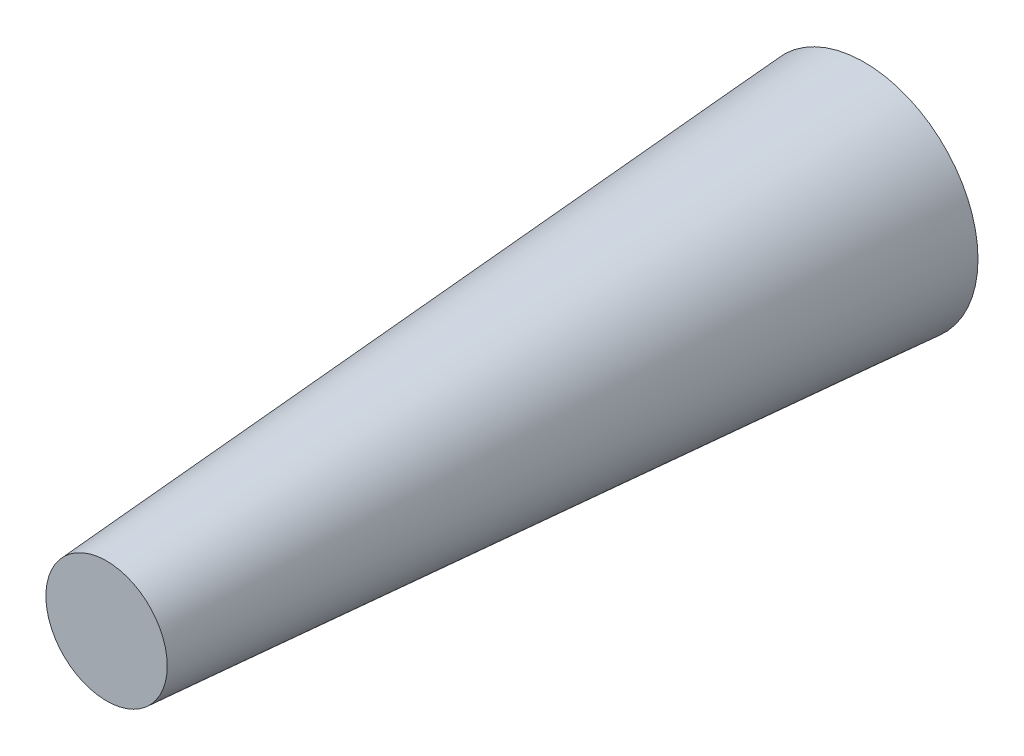
ISO-10303-21;
HEADER;
FILE_DESCRIPTION(('STEP AP214'),'2;1');
FILE_NAME('part.step','',(''),(''),'','','');
FILE_SCHEMA(('AUTOMOTIVE_DESIGN { 1 0 10303 214 1 1 1 1 }'));
ENDSEC;
DATA;
#1=APPLICATION_CONTEXT('core data for automotive mechanical design processes');
#2=APPLICATION_PROTOCOL_DEFINITION('international standard','automotive_design',2000,#1);
#3=PRODUCT_CONTEXT('',#1,'mechanical');
#4=PRODUCT('Part','Part','',(#3));
#5=PRODUCT_RELATED_PRODUCT_CATEGORY('part','',(#4));
#6=PRODUCT_DEFINITION_FORMATION('','',#4);
#7=PRODUCT_DEFINITION_CONTEXT('part definition',#1,'design');
#8=PRODUCT_DEFINITION('design','',#6,#7);
#9=PRODUCT_DEFINITION_SHAPE('','',#8);
#10=(LENGTH_UNIT() NAMED_UNIT(*) SI_UNIT(.MILLI.,.METRE.));
#11=(NAMED_UNIT(*) PLANE_ANGLE_UNIT() SI_UNIT($,.RADIAN.));
#12=(NAMED_UNIT(*) SI_UNIT($,.STERADIAN.) SOLID_ANGLE_UNIT());
#13=UNCERTAINTY_MEASURE_WITH_UNIT(LENGTH_MEASURE(1.E-05),#10,'distance_accuracy_value','');
#14=(GEOMETRIC_REPRESENTATION_CONTEXT(3) GLOBAL_UNCERTAINTY_ASSIGNED_CONTEXT((#13)) GLOBAL_UNIT_ASSIGNED_CONTEXT((#10,
#11,#12)) REPRESENTATION_CONTEXT('',''));
#15=CARTESIAN_POINT('',(0.,0.,0.));
#16=DIRECTION('',(0.,0.,1.));
#17=DIRECTION('',(1.,0.,0.));
#18=AXIS2_PLACEMENT_3D('',#15,#16,#17);
#19=CARTESIAN_POINT('',(0.,0.,0.));
#20=DIRECTION('',(0.,0.,-1.));
#21=DIRECTION('',(1.,0.,0.));
#22=AXIS2_PLACEMENT_3D('',#19,#20,#21);
#23=CONICAL_SURFACE('',#22,1.5,0.0698131700797732);
#24=CARTESIAN_POINT('',(0.,0.,10.));
#25=DIRECTION('',(0.,0.,1.));
#26=DIRECTION('',(1.,0.,0.));
#27=AXIS2_PLACEMENT_3D('',#24,#25,#26);
#28=CIRCLE('',#27,0.800731880564897);
#29=CARTESIAN_POINT('',(0.800731880564897,0.,10.));
#30=VERTEX_POINT('',#29);
#31=EDGE_CURVE('E10',#30,#30,#28,.T.);
#32=ORIENTED_EDGE('',*,*,#31,.F.);
#33=EDGE_LOOP('',(#32));
#34=FACE_BOUND('',#33,.T.);
#35=CARTESIAN_POINT('',(0.,0.,0.));
#36=DIRECTION('',(0.,0.,1.));
#37=DIRECTION('',(1.,0.,0.));
#38=AXIS2_PLACEMENT_3D('',#35,#36,#37);
#39=CIRCLE('',#38,1.5);
#40=CARTESIAN_POINT('',(1.5,0.,0.));
#41=VERTEX_POINT('',#40);
#42=EDGE_CURVE('E50',#41,#41,#39,.T.);
#43=ORIENTED_EDGE('',*,*,#42,.T.);
#44=EDGE_LOOP('',(#43));
#45=FACE_BOUND('',#44,.T.);
#46=ADVANCED_FACE('F43',(#34,#45),#23,.T.);
#47=CARTESIAN_POINT('',(0.,0.,10.));
#48=DIRECTION('',(0.,0.,1.));
#49=DIRECTION('',(1.,0.,0.));
#50=AXIS2_PLACEMENT_3D('',#47,#48,#49);
#51=PLANE('',#50);
#52=ORIENTED_EDGE('',*,*,#31,.T.);
#53=EDGE_LOOP('',(#52));
#54=FACE_BOUND('',#53,.T.);
#55=ADVANCED_FACE('F60',(#54),#51,.T.);
#56=CARTESIAN_POINT('',(0.,0.,0.));
#57=DIRECTION('',(0.,0.,1.));
#58=DIRECTION('',(1.,0.,0.));
#59=AXIS2_PLACEMENT_3D('',#56,#57,#58);
#60=PLANE('',#59);
#61=ORIENTED_EDGE('',*,*,#42,.F.);
#62=EDGE_LOOP('',(#61));
#63=FACE_BOUND('',#62,.T.);
#64=ADVANCED_FACE('F58',(#63),#60,.F.);
#65=CLOSED_SHELL('',(#46,#55,#64));
#66=MANIFOLD_SOLID_BREP('B2',#65);
#67=ADVANCED_BREP_SHAPE_REPRESENTATION('',(#18,#66),#14);
#68=SHAPE_DEFINITION_REPRESENTATION(#9,#67);
ENDSEC;
END-ISO-10303-21;
